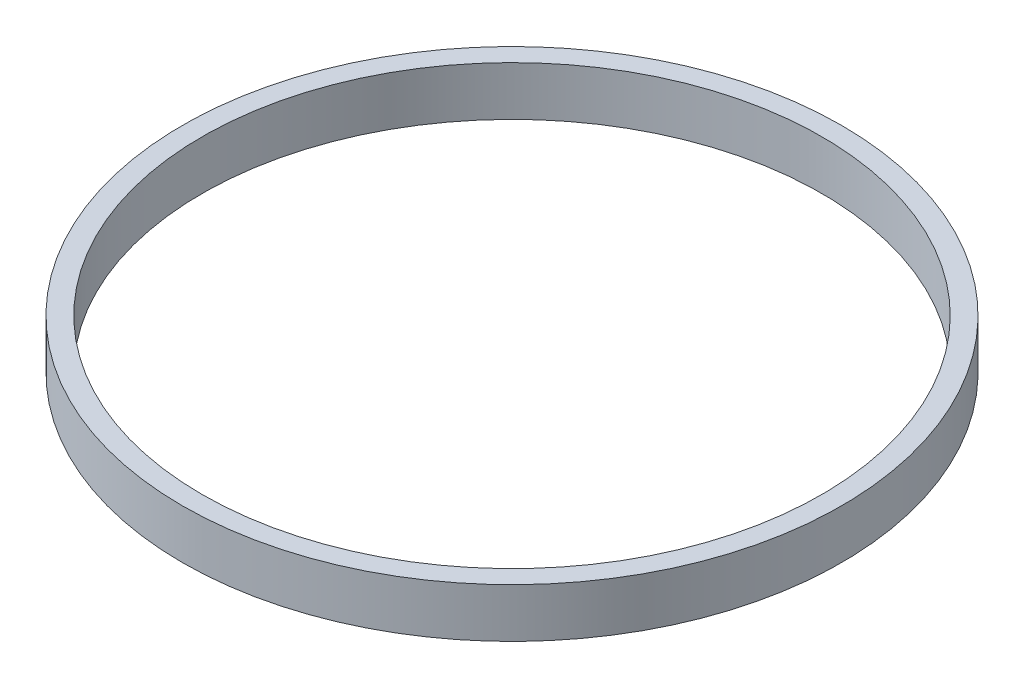
ISO-10303-21;
HEADER;
FILE_DESCRIPTION(('STEP AP214'),'2;1');
FILE_NAME('part.step','',(''),(''),'','','');
FILE_SCHEMA(('AUTOMOTIVE_DESIGN { 1 0 10303 214 1 1 1 1 }'));
ENDSEC;
DATA;
#1=APPLICATION_CONTEXT('core data for automotive mechanical design processes');
#2=APPLICATION_PROTOCOL_DEFINITION('international standard','automotive_design',2000,#1);
#3=PRODUCT_CONTEXT('',#1,'mechanical');
#4=PRODUCT('Part','Part','',(#3));
#5=PRODUCT_RELATED_PRODUCT_CATEGORY('part','',(#4));
#6=PRODUCT_DEFINITION_FORMATION('','',#4);
#7=PRODUCT_DEFINITION_CONTEXT('part definition',#1,'design');
#8=PRODUCT_DEFINITION('design','',#6,#7);
#9=PRODUCT_DEFINITION_SHAPE('','',#8);
#10=(LENGTH_UNIT() NAMED_UNIT(*) SI_UNIT(.MILLI.,.METRE.));
#11=(NAMED_UNIT(*) PLANE_ANGLE_UNIT() SI_UNIT($,.RADIAN.));
#12=(NAMED_UNIT(*) SI_UNIT($,.STERADIAN.) SOLID_ANGLE_UNIT());
#13=UNCERTAINTY_MEASURE_WITH_UNIT(LENGTH_MEASURE(1.E-05),#10,'distance_accuracy_value','');
#14=(GEOMETRIC_REPRESENTATION_CONTEXT(3) GLOBAL_UNCERTAINTY_ASSIGNED_CONTEXT((#13)) GLOBAL_UNIT_ASSIGNED_CONTEXT((#10,
#11,#12)) REPRESENTATION_CONTEXT('',''));
#15=CARTESIAN_POINT('',(0.,0.,0.));
#16=DIRECTION('',(0.,0.,1.));
#17=DIRECTION('',(1.,0.,0.));
#18=AXIS2_PLACEMENT_3D('',#15,#16,#17);
#19=CARTESIAN_POINT('',(0.,5.,0.));
#20=DIRECTION('',(0.,1.,0.));
#21=DIRECTION('',(0.,0.,1.));
#22=AXIS2_PLACEMENT_3D('',#19,#20,#21);
#23=PLANE('',#22);
#24=CARTESIAN_POINT('',(0.,5.,0.));
#25=DIRECTION('',(0.,1.,0.));
#26=DIRECTION('',(0.,0.,1.));
#27=AXIS2_PLACEMENT_3D('',#24,#25,#26);
#28=CIRCLE('',#27,33.5);
#29=CARTESIAN_POINT('',(0.,5.,33.5));
#30=VERTEX_POINT('',#29);
#31=EDGE_CURVE('E10',#30,#30,#28,.T.);
#32=ORIENTED_EDGE('',*,*,#31,.T.);
#33=EDGE_LOOP('',(#32));
#34=FACE_BOUND('',#33,.T.);
#35=CARTESIAN_POINT('',(0.,5.,0.));
#36=DIRECTION('',(0.,1.,0.));
#37=DIRECTION('',(0.,0.,1.));
#38=AXIS2_PLACEMENT_3D('',#35,#36,#37);
#39=CIRCLE('',#38,31.5);
#40=CARTESIAN_POINT('',(0.,5.,31.5));
#41=VERTEX_POINT('',#40);
#42=EDGE_CURVE('E42',#41,#41,#39,.T.);
#43=ORIENTED_EDGE('',*,*,#42,.F.);
#44=EDGE_LOOP('',(#43));
#45=FACE_BOUND('',#44,.T.);
#46=ADVANCED_FACE('F31',(#34,#45),#23,.T.);
#47=CARTESIAN_POINT('',(0.,0.,0.));
#48=DIRECTION('',(0.,1.,0.));
#49=DIRECTION('',(0.,0.,1.));
#50=AXIS2_PLACEMENT_3D('',#47,#48,#49);
#51=PLANE('',#50);
#52=CARTESIAN_POINT('',(0.,0.,0.));
#53=DIRECTION('',(0.,1.,0.));
#54=DIRECTION('',(0.,0.,1.));
#55=AXIS2_PLACEMENT_3D('',#52,#53,#54);
#56=CIRCLE('',#55,33.5);
#57=CARTESIAN_POINT('',(0.,0.,33.5));
#58=VERTEX_POINT('',#57);
#59=EDGE_CURVE('E35',#58,#58,#56,.T.);
#60=ORIENTED_EDGE('',*,*,#59,.F.);
#61=EDGE_LOOP('',(#60));
#62=FACE_BOUND('',#61,.T.);
#63=CARTESIAN_POINT('',(0.,0.,0.));
#64=DIRECTION('',(0.,1.,0.));
#65=DIRECTION('',(0.,0.,1.));
#66=AXIS2_PLACEMENT_3D('',#63,#64,#65);
#67=CIRCLE('',#66,31.5);
#68=CARTESIAN_POINT('',(0.,0.,31.5));
#69=VERTEX_POINT('',#68);
#70=EDGE_CURVE('E44',#69,#69,#67,.T.);
#71=ORIENTED_EDGE('',*,*,#70,.T.);
#72=EDGE_LOOP('',(#71));
#73=FACE_BOUND('',#72,.T.);
#74=ADVANCED_FACE('F54',(#62,#73),#51,.F.);
#75=CARTESIAN_POINT('',(0.,5.,0.));
#76=DIRECTION('',(0.,-1.,0.));
#77=DIRECTION('',(0.,0.,-1.));
#78=AXIS2_PLACEMENT_3D('',#75,#76,#77);
#79=CYLINDRICAL_SURFACE('',#78,33.5);
#80=ORIENTED_EDGE('',*,*,#31,.F.);
#81=EDGE_LOOP('',(#80));
#82=FACE_BOUND('',#81,.T.);
#83=ORIENTED_EDGE('',*,*,#59,.T.);
#84=EDGE_LOOP('',(#83));
#85=FACE_BOUND('',#84,.T.);
#86=ADVANCED_FACE('F33',(#82,#85),#79,.T.);
#87=CARTESIAN_POINT('',(0.,5.,0.));
#88=DIRECTION('',(0.,-1.,0.));
#89=DIRECTION('',(0.,0.,-1.));
#90=AXIS2_PLACEMENT_3D('',#87,#88,#89);
#91=CYLINDRICAL_SURFACE('',#90,31.5);
#92=ORIENTED_EDGE('',*,*,#42,.T.);
#93=EDGE_LOOP('',(#92));
#94=FACE_BOUND('',#93,.T.);
#95=ORIENTED_EDGE('',*,*,#70,.F.);
#96=EDGE_LOOP('',(#95));
#97=FACE_BOUND('',#96,.T.);
#98=ADVANCED_FACE('F50',(#94,#97),#91,.F.);
#99=CLOSED_SHELL('',(#46,#74,#86,#98));
#100=MANIFOLD_SOLID_BREP('B2',#99);
#101=ADVANCED_BREP_SHAPE_REPRESENTATION('',(#18,#100),#14);
#102=SHAPE_DEFINITION_REPRESENTATION(#9,#101);
ENDSEC;
END-ISO-10303-21;
